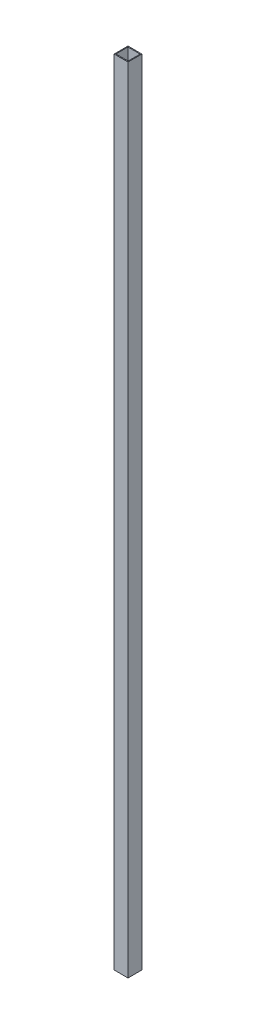
ISO-10303-21;
HEADER;
FILE_DESCRIPTION(('STEP AP214'),'2;1');
FILE_NAME('part.step','',(''),(''),'','','');
FILE_SCHEMA(('AUTOMOTIVE_DESIGN { 1 0 10303 214 1 1 1 1 }'));
ENDSEC;
DATA;
#1=APPLICATION_CONTEXT('core data for automotive mechanical design processes');
#2=APPLICATION_PROTOCOL_DEFINITION('international standard','automotive_design',2000,#1);
#3=PRODUCT_CONTEXT('',#1,'mechanical');
#4=PRODUCT('Part','Part','',(#3));
#5=PRODUCT_RELATED_PRODUCT_CATEGORY('part','',(#4));
#6=PRODUCT_DEFINITION_FORMATION('','',#4);
#7=PRODUCT_DEFINITION_CONTEXT('part definition',#1,'design');
#8=PRODUCT_DEFINITION('design','',#6,#7);
#9=PRODUCT_DEFINITION_SHAPE('','',#8);
#10=(LENGTH_UNIT() NAMED_UNIT(*) SI_UNIT(.MILLI.,.METRE.));
#11=(NAMED_UNIT(*) PLANE_ANGLE_UNIT() SI_UNIT($,.RADIAN.));
#12=(NAMED_UNIT(*) SI_UNIT($,.STERADIAN.) SOLID_ANGLE_UNIT());
#13=UNCERTAINTY_MEASURE_WITH_UNIT(LENGTH_MEASURE(1.E-05),#10,'distance_accuracy_value','');
#14=(GEOMETRIC_REPRESENTATION_CONTEXT(3) GLOBAL_UNCERTAINTY_ASSIGNED_CONTEXT((#13)) GLOBAL_UNIT_ASSIGNED_CONTEXT((#10,
#11,#12)) REPRESENTATION_CONTEXT('',''));
#15=CARTESIAN_POINT('',(0.,0.,0.));
#16=DIRECTION('',(0.,0.,1.));
#17=DIRECTION('',(1.,0.,0.));
#18=AXIS2_PLACEMENT_3D('',#15,#16,#17);
#19=CARTESIAN_POINT('',(10.,1143.,-10.));
#20=DIRECTION('',(-1.,0.,0.));
#21=DIRECTION('',(0.,0.,1.));
#22=AXIS2_PLACEMENT_3D('',#19,#20,#21);
#23=PLANE('',#22);
#24=DIRECTION('',(0.,0.,-1.));
#25=VECTOR('',#24,1.);
#26=CARTESIAN_POINT('',(10.,0.,-10.));
#27=LINE('',#26,#25);
#28=CARTESIAN_POINT('',(10.,0.,10.));
#29=VERTEX_POINT('',#28);
#30=CARTESIAN_POINT('',(10.,0.,-10.));
#31=VERTEX_POINT('',#30);
#32=EDGE_CURVE('E153',#29,#31,#27,.T.);
#33=ORIENTED_EDGE('',*,*,#32,.T.);
#34=DIRECTION('',(0.,-1.,0.));
#35=VECTOR('',#34,1.);
#36=CARTESIAN_POINT('',(10.,1143.,-10.));
#37=LINE('',#36,#35);
#38=CARTESIAN_POINT('',(10.,1143.,-10.));
#39=VERTEX_POINT('',#38);
#40=EDGE_CURVE('E11',#39,#31,#37,.T.);
#41=ORIENTED_EDGE('',*,*,#40,.F.);
#42=DIRECTION('',(0.,0.,-1.));
#43=VECTOR('',#42,1.);
#44=CARTESIAN_POINT('',(10.,1143.,-10.));
#45=LINE('',#44,#43);
#46=CARTESIAN_POINT('',(10.,1143.,10.));
#47=VERTEX_POINT('',#46);
#48=EDGE_CURVE('E159',#47,#39,#45,.T.);
#49=ORIENTED_EDGE('',*,*,#48,.F.);
#50=DIRECTION('',(0.,-1.,0.));
#51=VECTOR('',#50,1.);
#52=CARTESIAN_POINT('',(10.,1143.,10.));
#53=LINE('',#52,#51);
#54=EDGE_CURVE('E173',#47,#29,#53,.T.);
#55=ORIENTED_EDGE('',*,*,#54,.T.);
#56=EDGE_LOOP('',(#33,#41,#49,#55));
#57=FACE_BOUND('',#56,.T.);
#58=ADVANCED_FACE('F45',(#57),#23,.F.);
#59=CARTESIAN_POINT('',(-10.,1143.,-10.));
#60=DIRECTION('',(0.,0.,1.));
#61=DIRECTION('',(1.,0.,0.));
#62=AXIS2_PLACEMENT_3D('',#59,#60,#61);
#63=PLANE('',#62);
#64=DIRECTION('',(-1.,0.,0.));
#65=VECTOR('',#64,1.);
#66=CARTESIAN_POINT('',(-10.,0.,-10.));
#67=LINE('',#66,#65);
#68=CARTESIAN_POINT('',(-10.,0.,-10.));
#69=VERTEX_POINT('',#68);
#70=EDGE_CURVE('E177',#31,#69,#67,.T.);
#71=ORIENTED_EDGE('',*,*,#70,.T.);
#72=DIRECTION('',(0.,-1.,0.));
#73=VECTOR('',#72,1.);
#74=CARTESIAN_POINT('',(-10.,1143.,-10.));
#75=LINE('',#74,#73);
#76=CARTESIAN_POINT('',(-10.,1143.,-10.));
#77=VERTEX_POINT('',#76);
#78=EDGE_CURVE('E53',#77,#69,#75,.T.);
#79=ORIENTED_EDGE('',*,*,#78,.F.);
#80=DIRECTION('',(-1.,0.,0.));
#81=VECTOR('',#80,1.);
#82=CARTESIAN_POINT('',(-10.,1143.,-10.));
#83=LINE('',#82,#81);
#84=EDGE_CURVE('E163',#39,#77,#83,.T.);
#85=ORIENTED_EDGE('',*,*,#84,.F.);
#86=ORIENTED_EDGE('',*,*,#40,.T.);
#87=EDGE_LOOP('',(#71,#79,#85,#86));
#88=FACE_BOUND('',#87,.T.);
#89=ADVANCED_FACE('F211',(#88),#63,.F.);
#90=CARTESIAN_POINT('',(-10.,1143.,-10.));
#91=DIRECTION('',(1.,0.,0.));
#92=DIRECTION('',(0.,0.,-1.));
#93=AXIS2_PLACEMENT_3D('',#90,#91,#92);
#94=PLANE('',#93);
#95=DIRECTION('',(0.,0.,1.));
#96=VECTOR('',#95,1.);
#97=CARTESIAN_POINT('',(-10.,0.,-10.));
#98=LINE('',#97,#96);
#99=CARTESIAN_POINT('',(-10.,0.,10.));
#100=VERTEX_POINT('',#99);
#101=EDGE_CURVE('E180',#69,#100,#98,.T.);
#102=ORIENTED_EDGE('',*,*,#101,.T.);
#103=DIRECTION('',(0.,-1.,0.));
#104=VECTOR('',#103,1.);
#105=CARTESIAN_POINT('',(-10.,1143.,10.));
#106=LINE('',#105,#104);
#107=CARTESIAN_POINT('',(-10.,1143.,10.));
#108=VERTEX_POINT('',#107);
#109=EDGE_CURVE('E188',#108,#100,#106,.T.);
#110=ORIENTED_EDGE('',*,*,#109,.F.);
#111=DIRECTION('',(0.,0.,1.));
#112=VECTOR('',#111,1.);
#113=CARTESIAN_POINT('',(-10.,1143.,-10.));
#114=LINE('',#113,#112);
#115=EDGE_CURVE('E167',#77,#108,#114,.T.);
#116=ORIENTED_EDGE('',*,*,#115,.F.);
#117=ORIENTED_EDGE('',*,*,#78,.T.);
#118=EDGE_LOOP('',(#102,#110,#116,#117));
#119=FACE_BOUND('',#118,.T.);
#120=ADVANCED_FACE('F197',(#119),#94,.F.);
#121=CARTESIAN_POINT('',(-10.,1143.,10.));
#122=DIRECTION('',(0.,0.,-1.));
#123=DIRECTION('',(-1.,0.,0.));
#124=AXIS2_PLACEMENT_3D('',#121,#122,#123);
#125=PLANE('',#124);
#126=DIRECTION('',(1.,0.,0.));
#127=VECTOR('',#126,1.);
#128=CARTESIAN_POINT('',(-10.,0.,10.));
#129=LINE('',#128,#127);
#130=EDGE_CURVE('E164',#100,#29,#129,.T.);
#131=ORIENTED_EDGE('',*,*,#130,.T.);
#132=ORIENTED_EDGE('',*,*,#54,.F.);
#133=DIRECTION('',(1.,0.,0.));
#134=VECTOR('',#133,1.);
#135=CARTESIAN_POINT('',(-10.,1143.,10.));
#136=LINE('',#135,#134);
#137=EDGE_CURVE('E170',#108,#47,#136,.T.);
#138=ORIENTED_EDGE('',*,*,#137,.F.);
#139=ORIENTED_EDGE('',*,*,#109,.T.);
#140=EDGE_LOOP('',(#131,#132,#138,#139));
#141=FACE_BOUND('',#140,.T.);
#142=ADVANCED_FACE('F206',(#141),#125,.F.);
#143=CARTESIAN_POINT('',(0.,1143.,0.));
#144=DIRECTION('',(0.,1.,0.));
#145=DIRECTION('',(0.,0.,1.));
#146=AXIS2_PLACEMENT_3D('',#143,#144,#145);
#147=PLANE('',#146);
#148=DIRECTION('',(0.,0.,1.));
#149=VECTOR('',#148,1.);
#150=CARTESIAN_POINT('',(8.83776910912128,1143.,8.67453854509663));
#151=LINE('',#150,#149);
#152=CARTESIAN_POINT('',(8.83776910912128,1143.,-8.67453854509663));
#153=VERTEX_POINT('',#152);
#154=CARTESIAN_POINT('',(8.83776910912128,1143.,8.67453854509663));
#155=VERTEX_POINT('',#154);
#156=EDGE_CURVE('E112',#153,#155,#151,.T.);
#157=ORIENTED_EDGE('',*,*,#156,.T.);
#158=DIRECTION('',(-1.,0.,0.));
#159=VECTOR('',#158,1.);
#160=CARTESIAN_POINT('',(-8.83776910912128,1143.,8.67453854509663));
#161=LINE('',#160,#159);
#162=CARTESIAN_POINT('',(-8.83776910912128,1143.,8.67453854509663));
#163=VERTEX_POINT('',#162);
#164=EDGE_CURVE('E122',#155,#163,#161,.T.);
#165=ORIENTED_EDGE('',*,*,#164,.T.);
#166=DIRECTION('',(0.,0.,-1.));
#167=VECTOR('',#166,1.);
#168=CARTESIAN_POINT('',(-8.83776910912128,1143.,8.67453854509663));
#169=LINE('',#168,#167);
#170=CARTESIAN_POINT('',(-8.83776910912128,1143.,-8.67453854509663));
#171=VERTEX_POINT('',#170);
#172=EDGE_CURVE('E60',#163,#171,#169,.T.);
#173=ORIENTED_EDGE('',*,*,#172,.T.);
#174=DIRECTION('',(1.,0.,0.));
#175=VECTOR('',#174,1.);
#176=CARTESIAN_POINT('',(-8.83776910912128,1143.,-8.67453854509663));
#177=LINE('',#176,#175);
#178=EDGE_CURVE('E119',#171,#153,#177,.T.);
#179=ORIENTED_EDGE('',*,*,#178,.T.);
#180=EDGE_LOOP('',(#157,#165,#173,#179));
#181=FACE_BOUND('',#180,.T.);
#182=ORIENTED_EDGE('',*,*,#48,.T.);
#183=ORIENTED_EDGE('',*,*,#84,.T.);
#184=ORIENTED_EDGE('',*,*,#115,.T.);
#185=ORIENTED_EDGE('',*,*,#137,.T.);
#186=EDGE_LOOP('',(#182,#183,#184,#185));
#187=FACE_BOUND('',#186,.T.);
#188=ADVANCED_FACE('F127',(#181,#187),#147,.T.);
#189=CARTESIAN_POINT('',(0.,0.,0.));
#190=DIRECTION('',(0.,1.,0.));
#191=DIRECTION('',(0.,0.,1.));
#192=AXIS2_PLACEMENT_3D('',#189,#190,#191);
#193=PLANE('',#192);
#194=DIRECTION('',(-1.,0.,0.));
#195=VECTOR('',#194,1.);
#196=CARTESIAN_POINT('',(-8.83776910912128,0.,8.67453854509663));
#197=LINE('',#196,#195);
#198=CARTESIAN_POINT('',(8.83776910912128,0.,8.67453854509663));
#199=VERTEX_POINT('',#198);
#200=CARTESIAN_POINT('',(-8.83776910912128,0.,8.67453854509663));
#201=VERTEX_POINT('',#200);
#202=EDGE_CURVE('E144',#199,#201,#197,.T.);
#203=ORIENTED_EDGE('',*,*,#202,.F.);
#204=DIRECTION('',(0.,0.,1.));
#205=VECTOR('',#204,1.);
#206=CARTESIAN_POINT('',(8.83776910912128,0.,8.67453854509663));
#207=LINE('',#206,#205);
#208=CARTESIAN_POINT('',(8.83776910912128,0.,-8.67453854509663));
#209=VERTEX_POINT('',#208);
#210=EDGE_CURVE('E68',#209,#199,#207,.T.);
#211=ORIENTED_EDGE('',*,*,#210,.F.);
#212=DIRECTION('',(1.,0.,0.));
#213=VECTOR('',#212,1.);
#214=CARTESIAN_POINT('',(-8.83776910912128,0.,-8.67453854509663));
#215=LINE('',#214,#213);
#216=CARTESIAN_POINT('',(-8.83776910912128,0.,-8.67453854509663));
#217=VERTEX_POINT('',#216);
#218=EDGE_CURVE('E131',#217,#209,#215,.T.);
#219=ORIENTED_EDGE('',*,*,#218,.F.);
#220=DIRECTION('',(0.,0.,-1.));
#221=VECTOR('',#220,1.);
#222=CARTESIAN_POINT('',(-8.83776910912128,0.,8.67453854509663));
#223=LINE('',#222,#221);
#224=EDGE_CURVE('E135',#201,#217,#223,.T.);
#225=ORIENTED_EDGE('',*,*,#224,.F.);
#226=EDGE_LOOP('',(#203,#211,#219,#225));
#227=FACE_BOUND('',#226,.T.);
#228=ORIENTED_EDGE('',*,*,#32,.F.);
#229=ORIENTED_EDGE('',*,*,#130,.F.);
#230=ORIENTED_EDGE('',*,*,#101,.F.);
#231=ORIENTED_EDGE('',*,*,#70,.F.);
#232=EDGE_LOOP('',(#228,#229,#230,#231));
#233=FACE_BOUND('',#232,.T.);
#234=ADVANCED_FACE('F203',(#227,#233),#193,.F.);
#235=CARTESIAN_POINT('',(8.83776910912128,1143.,8.67453854509663));
#236=DIRECTION('',(1.,0.,0.));
#237=DIRECTION('',(0.,0.,-1.));
#238=AXIS2_PLACEMENT_3D('',#235,#236,#237);
#239=PLANE('',#238);
#240=ORIENTED_EDGE('',*,*,#210,.T.);
#241=DIRECTION('',(0.,-1.,0.));
#242=VECTOR('',#241,1.);
#243=CARTESIAN_POINT('',(8.83776910912128,1143.,8.67453854509663));
#244=LINE('',#243,#242);
#245=EDGE_CURVE('E108',#155,#199,#244,.T.);
#246=ORIENTED_EDGE('',*,*,#245,.F.);
#247=ORIENTED_EDGE('',*,*,#156,.F.);
#248=DIRECTION('',(0.,-1.,0.));
#249=VECTOR('',#248,1.);
#250=CARTESIAN_POINT('',(8.83776910912128,1143.,-8.67453854509663));
#251=LINE('',#250,#249);
#252=EDGE_CURVE('E150',#153,#209,#251,.T.);
#253=ORIENTED_EDGE('',*,*,#252,.T.);
#254=EDGE_LOOP('',(#240,#246,#247,#253));
#255=FACE_BOUND('',#254,.T.);
#256=ADVANCED_FACE('F110',(#255),#239,.F.);
#257=CARTESIAN_POINT('',(-8.83776910912128,1143.,-8.67453854509663));
#258=DIRECTION('',(0.,0.,-1.));
#259=DIRECTION('',(-1.,0.,0.));
#260=AXIS2_PLACEMENT_3D('',#257,#258,#259);
#261=PLANE('',#260);
#262=ORIENTED_EDGE('',*,*,#218,.T.);
#263=ORIENTED_EDGE('',*,*,#252,.F.);
#264=ORIENTED_EDGE('',*,*,#178,.F.);
#265=DIRECTION('',(0.,-1.,0.));
#266=VECTOR('',#265,1.);
#267=CARTESIAN_POINT('',(-8.83776910912128,1143.,-8.67453854509663));
#268=LINE('',#267,#266);
#269=EDGE_CURVE('E154',#171,#217,#268,.T.);
#270=ORIENTED_EDGE('',*,*,#269,.T.);
#271=EDGE_LOOP('',(#262,#263,#264,#270));
#272=FACE_BOUND('',#271,.T.);
#273=ADVANCED_FACE('F228',(#272),#261,.F.);
#274=CARTESIAN_POINT('',(-8.83776910912128,1143.,8.67453854509663));
#275=DIRECTION('',(-1.,0.,0.));
#276=DIRECTION('',(0.,0.,1.));
#277=AXIS2_PLACEMENT_3D('',#274,#275,#276);
#278=PLANE('',#277);
#279=ORIENTED_EDGE('',*,*,#224,.T.);
#280=ORIENTED_EDGE('',*,*,#269,.F.);
#281=ORIENTED_EDGE('',*,*,#172,.F.);
#282=DIRECTION('',(0.,-1.,0.));
#283=VECTOR('',#282,1.);
#284=CARTESIAN_POINT('',(-8.83776910912128,1143.,8.67453854509663));
#285=LINE('',#284,#283);
#286=EDGE_CURVE('E118',#163,#201,#285,.T.);
#287=ORIENTED_EDGE('',*,*,#286,.T.);
#288=EDGE_LOOP('',(#279,#280,#281,#287));
#289=FACE_BOUND('',#288,.T.);
#290=ADVANCED_FACE('F231',(#289),#278,.F.);
#291=CARTESIAN_POINT('',(-8.83776910912128,1143.,8.67453854509663));
#292=DIRECTION('',(0.,0.,1.));
#293=DIRECTION('',(1.,0.,0.));
#294=AXIS2_PLACEMENT_3D('',#291,#292,#293);
#295=PLANE('',#294);
#296=ORIENTED_EDGE('',*,*,#202,.T.);
#297=ORIENTED_EDGE('',*,*,#286,.F.);
#298=ORIENTED_EDGE('',*,*,#164,.F.);
#299=ORIENTED_EDGE('',*,*,#245,.T.);
#300=EDGE_LOOP('',(#296,#297,#298,#299));
#301=FACE_BOUND('',#300,.T.);
#302=ADVANCED_FACE('F123',(#301),#295,.F.);
#303=CLOSED_SHELL('',(#58,#89,#120,#142,#188,#234,#256,#273,#290,#302));
#304=MANIFOLD_SOLID_BREP('B2',#303);
#305=ADVANCED_BREP_SHAPE_REPRESENTATION('',(#18,#304),#14);
#306=SHAPE_DEFINITION_REPRESENTATION(#9,#305);
ENDSEC;
END-ISO-10303-21;
